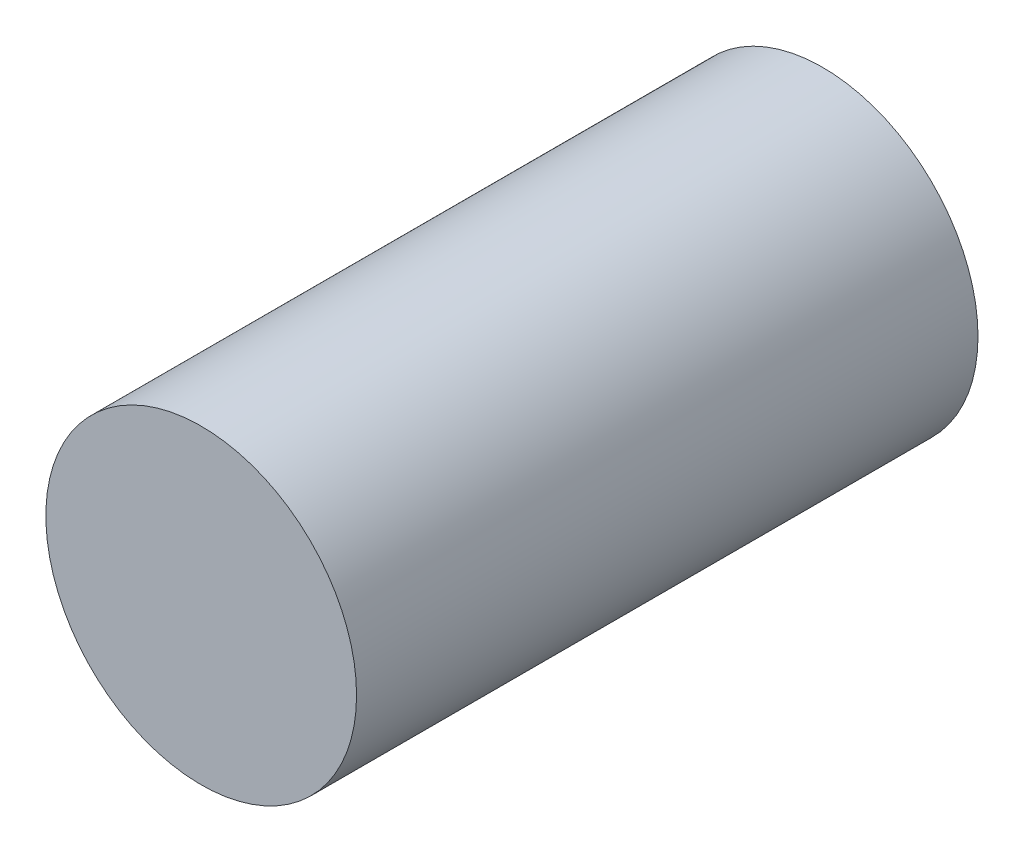
ISO-10303-21;
HEADER;
FILE_DESCRIPTION(('STEP AP214'),'2;1');
FILE_NAME('part.step','',(''),(''),'','','');
FILE_SCHEMA(('AUTOMOTIVE_DESIGN { 1 0 10303 214 1 1 1 1 }'));
ENDSEC;
DATA;
#1=APPLICATION_CONTEXT('core data for automotive mechanical design processes');
#2=APPLICATION_PROTOCOL_DEFINITION('international standard','automotive_design',2000,#1);
#3=PRODUCT_CONTEXT('',#1,'mechanical');
#4=PRODUCT('Part','Part','',(#3));
#5=PRODUCT_RELATED_PRODUCT_CATEGORY('part','',(#4));
#6=PRODUCT_DEFINITION_FORMATION('','',#4);
#7=PRODUCT_DEFINITION_CONTEXT('part definition',#1,'design');
#8=PRODUCT_DEFINITION('design','',#6,#7);
#9=PRODUCT_DEFINITION_SHAPE('','',#8);
#10=(LENGTH_UNIT() NAMED_UNIT(*) SI_UNIT(.MILLI.,.METRE.));
#11=(NAMED_UNIT(*) PLANE_ANGLE_UNIT() SI_UNIT($,.RADIAN.));
#12=(NAMED_UNIT(*) SI_UNIT($,.STERADIAN.) SOLID_ANGLE_UNIT());
#13=UNCERTAINTY_MEASURE_WITH_UNIT(LENGTH_MEASURE(1.E-05),#10,'distance_accuracy_value','');
#14=(GEOMETRIC_REPRESENTATION_CONTEXT(3) GLOBAL_UNCERTAINTY_ASSIGNED_CONTEXT((#13)) GLOBAL_UNIT_ASSIGNED_CONTEXT((#10,
#11,#12)) REPRESENTATION_CONTEXT('',''));
#15=CARTESIAN_POINT('',(0.,0.,0.));
#16=DIRECTION('',(0.,0.,1.));
#17=DIRECTION('',(1.,0.,0.));
#18=AXIS2_PLACEMENT_3D('',#15,#16,#17);
#19=CARTESIAN_POINT('',(0.,0.,200.));
#20=DIRECTION('',(0.,0.,-1.));
#21=DIRECTION('',(-1.,0.,0.));
#22=AXIS2_PLACEMENT_3D('',#19,#20,#21);
#23=CYLINDRICAL_SURFACE('',#22,50.);
#24=CARTESIAN_POINT('',(0.,0.,200.));
#25=DIRECTION('',(0.,0.,1.));
#26=DIRECTION('',(1.,0.,0.));
#27=AXIS2_PLACEMENT_3D('',#24,#25,#26);
#28=CIRCLE('',#27,50.);
#29=CARTESIAN_POINT('',(50.,0.,200.));
#30=VERTEX_POINT('',#29);
#31=EDGE_CURVE('E10',#30,#30,#28,.T.);
#32=ORIENTED_EDGE('',*,*,#31,.F.);
#33=EDGE_LOOP('',(#32));
#34=FACE_BOUND('',#33,.T.);
#35=CARTESIAN_POINT('',(0.,0.,0.));
#36=DIRECTION('',(0.,0.,1.));
#37=DIRECTION('',(1.,0.,0.));
#38=AXIS2_PLACEMENT_3D('',#35,#36,#37);
#39=CIRCLE('',#38,50.);
#40=CARTESIAN_POINT('',(50.,0.,0.));
#41=VERTEX_POINT('',#40);
#42=EDGE_CURVE('E46',#41,#41,#39,.T.);
#43=ORIENTED_EDGE('',*,*,#42,.T.);
#44=EDGE_LOOP('',(#43));
#45=FACE_BOUND('',#44,.T.);
#46=ADVANCED_FACE('F43',(#34,#45),#23,.T.);
#47=CARTESIAN_POINT('',(0.,0.,200.));
#48=DIRECTION('',(0.,0.,1.));
#49=DIRECTION('',(1.,0.,0.));
#50=AXIS2_PLACEMENT_3D('',#47,#48,#49);
#51=PLANE('',#50);
#52=ORIENTED_EDGE('',*,*,#31,.T.);
#53=EDGE_LOOP('',(#52));
#54=FACE_BOUND('',#53,.T.);
#55=ADVANCED_FACE('F58',(#54),#51,.T.);
#56=CARTESIAN_POINT('',(0.,0.,0.));
#57=DIRECTION('',(0.,0.,1.));
#58=DIRECTION('',(1.,0.,0.));
#59=AXIS2_PLACEMENT_3D('',#56,#57,#58);
#60=PLANE('',#59);
#61=ORIENTED_EDGE('',*,*,#42,.F.);
#62=EDGE_LOOP('',(#61));
#63=FACE_BOUND('',#62,.T.);
#64=ADVANCED_FACE('F59',(#63),#60,.F.);
#65=CLOSED_SHELL('',(#46,#55,#64));
#66=MANIFOLD_SOLID_BREP('B2',#65);
#67=ADVANCED_BREP_SHAPE_REPRESENTATION('',(#18,#66),#14);
#68=SHAPE_DEFINITION_REPRESENTATION(#9,#67);
ENDSEC;
END-ISO-10303-21;
